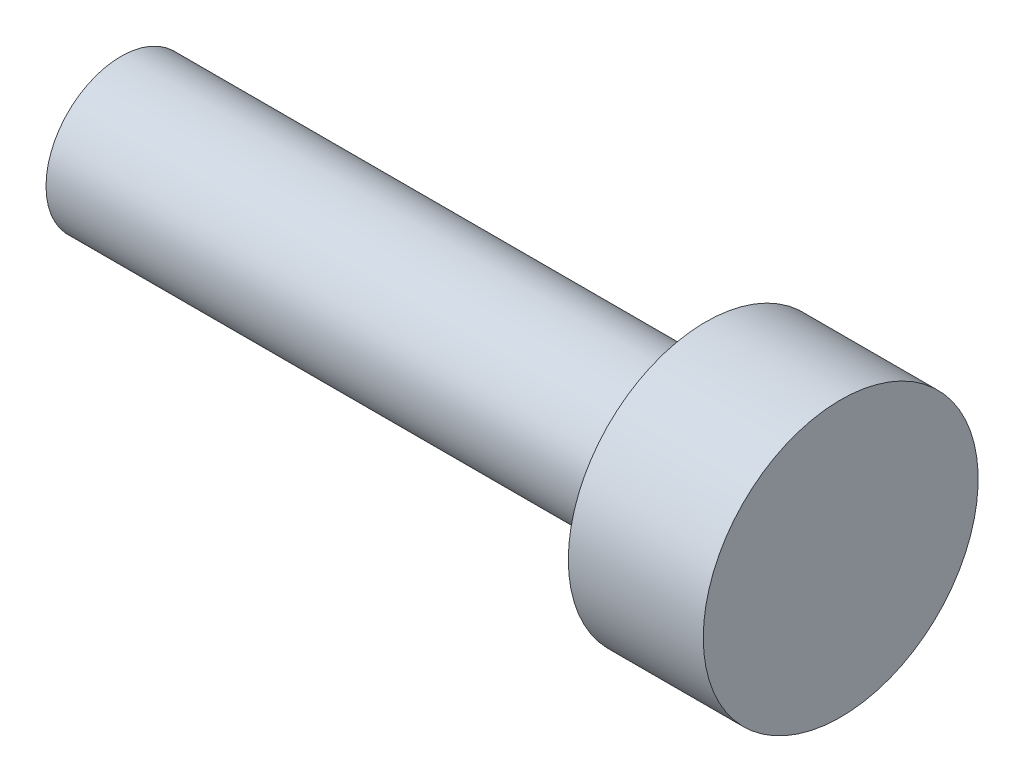
ISO-10303-21;
HEADER;
FILE_DESCRIPTION(('STEP AP214'),'2;1');
FILE_NAME('part.step','',(''),(''),'','','');
FILE_SCHEMA(('AUTOMOTIVE_DESIGN { 1 0 10303 214 1 1 1 1 }'));
ENDSEC;
DATA;
#1=APPLICATION_CONTEXT('core data for automotive mechanical design processes');
#2=APPLICATION_PROTOCOL_DEFINITION('international standard','automotive_design',2000,#1);
#3=PRODUCT_CONTEXT('',#1,'mechanical');
#4=PRODUCT('Part','Part','',(#3));
#5=PRODUCT_RELATED_PRODUCT_CATEGORY('part','',(#4));
#6=PRODUCT_DEFINITION_FORMATION('','',#4);
#7=PRODUCT_DEFINITION_CONTEXT('part definition',#1,'design');
#8=PRODUCT_DEFINITION('design','',#6,#7);
#9=PRODUCT_DEFINITION_SHAPE('','',#8);
#10=(LENGTH_UNIT() NAMED_UNIT(*) SI_UNIT(.MILLI.,.METRE.));
#11=(NAMED_UNIT(*) PLANE_ANGLE_UNIT() SI_UNIT($,.RADIAN.));
#12=(NAMED_UNIT(*) SI_UNIT($,.STERADIAN.) SOLID_ANGLE_UNIT());
#13=UNCERTAINTY_MEASURE_WITH_UNIT(LENGTH_MEASURE(1.E-05),#10,'distance_accuracy_value','');
#14=(GEOMETRIC_REPRESENTATION_CONTEXT(3) GLOBAL_UNCERTAINTY_ASSIGNED_CONTEXT((#13)) GLOBAL_UNIT_ASSIGNED_CONTEXT((#10,
#11,#12)) REPRESENTATION_CONTEXT('',''));
#15=CARTESIAN_POINT('',(0.,0.,0.));
#16=DIRECTION('',(0.,0.,1.));
#17=DIRECTION('',(1.,0.,0.));
#18=AXIS2_PLACEMENT_3D('',#15,#16,#17);
#19=CARTESIAN_POINT('',(165.,1.5,0.));
#20=DIRECTION('',(1.,0.,0.));
#21=DIRECTION('',(0.,0.,-1.));
#22=AXIS2_PLACEMENT_3D('',#19,#20,#21);
#23=PLANE('',#22);
#24=CARTESIAN_POINT('',(165.,0.,0.));
#25=DIRECTION('',(-1.,0.,0.));
#26=DIRECTION('',(0.,0.,1.));
#27=AXIS2_PLACEMENT_3D('',#24,#25,#26);
#28=CIRCLE('',#27,1.5);
#29=CARTESIAN_POINT('',(165.,0.,1.5));
#30=VERTEX_POINT('',#29);
#31=EDGE_CURVE('E54',#30,#30,#28,.T.);
#32=ORIENTED_EDGE('',*,*,#31,.T.);
#33=EDGE_LOOP('',(#32));
#34=FACE_BOUND('',#33,.T.);
#35=ADVANCED_FACE('F37',(#34),#23,.F.);
#36=CARTESIAN_POINT('',(179.4,0.,0.));
#37=DIRECTION('',(-1.,0.,0.));
#38=DIRECTION('',(0.,0.,1.));
#39=AXIS2_PLACEMENT_3D('',#36,#37,#38);
#40=PLANE('',#39);
#41=CARTESIAN_POINT('',(179.4,0.,0.));
#42=DIRECTION('',(-1.,0.,0.));
#43=DIRECTION('',(0.,0.,1.));
#44=AXIS2_PLACEMENT_3D('',#41,#42,#43);
#45=CIRCLE('',#44,2.75);
#46=CARTESIAN_POINT('',(179.4,0.,2.75));
#47=VERTEX_POINT('',#46);
#48=EDGE_CURVE('E10',#47,#47,#45,.T.);
#49=ORIENTED_EDGE('',*,*,#48,.F.);
#50=EDGE_LOOP('',(#49));
#51=FACE_BOUND('',#50,.T.);
#52=ADVANCED_FACE('F75',(#51),#40,.F.);
#53=CARTESIAN_POINT('',(-110.,0.,0.));
#54=DIRECTION('',(-1.,0.,0.));
#55=DIRECTION('',(0.,0.,1.));
#56=AXIS2_PLACEMENT_3D('',#53,#54,#55);
#57=CYLINDRICAL_SURFACE('',#56,2.75);
#58=CARTESIAN_POINT('',(176.7,0.,0.));
#59=DIRECTION('',(-1.,0.,0.));
#60=DIRECTION('',(0.,0.,1.));
#61=AXIS2_PLACEMENT_3D('',#58,#59,#60);
#62=CIRCLE('',#61,2.75);
#63=CARTESIAN_POINT('',(176.7,0.,2.75));
#64=VERTEX_POINT('',#63);
#65=EDGE_CURVE('E44',#64,#64,#62,.T.);
#66=ORIENTED_EDGE('',*,*,#65,.F.);
#67=EDGE_LOOP('',(#66));
#68=FACE_BOUND('',#67,.T.);
#69=ORIENTED_EDGE('',*,*,#48,.T.);
#70=EDGE_LOOP('',(#69));
#71=FACE_BOUND('',#70,.T.);
#72=ADVANCED_FACE('F70',(#68,#71),#57,.T.);
#73=CARTESIAN_POINT('',(176.7,2.75,0.));
#74=DIRECTION('',(1.,0.,0.));
#75=DIRECTION('',(0.,0.,-1.));
#76=AXIS2_PLACEMENT_3D('',#73,#74,#75);
#77=PLANE('',#76);
#78=CARTESIAN_POINT('',(176.7,0.,0.));
#79=DIRECTION('',(-1.,0.,0.));
#80=DIRECTION('',(0.,0.,1.));
#81=AXIS2_PLACEMENT_3D('',#78,#79,#80);
#82=CIRCLE('',#81,1.5);
#83=CARTESIAN_POINT('',(176.7,0.,1.5));
#84=VERTEX_POINT('',#83);
#85=EDGE_CURVE('E49',#84,#84,#82,.T.);
#86=ORIENTED_EDGE('',*,*,#85,.F.);
#87=EDGE_LOOP('',(#86));
#88=FACE_BOUND('',#87,.T.);
#89=ORIENTED_EDGE('',*,*,#65,.T.);
#90=EDGE_LOOP('',(#89));
#91=FACE_BOUND('',#90,.T.);
#92=ADVANCED_FACE('F65',(#88,#91),#77,.F.);
#93=CARTESIAN_POINT('',(-110.,0.,0.));
#94=DIRECTION('',(-1.,0.,0.));
#95=DIRECTION('',(0.,0.,1.));
#96=AXIS2_PLACEMENT_3D('',#93,#94,#95);
#97=CYLINDRICAL_SURFACE('',#96,1.5);
#98=ORIENTED_EDGE('',*,*,#31,.F.);
#99=EDGE_LOOP('',(#98));
#100=FACE_BOUND('',#99,.T.);
#101=ORIENTED_EDGE('',*,*,#85,.T.);
#102=EDGE_LOOP('',(#101));
#103=FACE_BOUND('',#102,.T.);
#104=ADVANCED_FACE('F62',(#100,#103),#97,.T.);
#105=CLOSED_SHELL('',(#35,#52,#72,#92,#104));
#106=MANIFOLD_SOLID_BREP('B2',#105);
#107=ADVANCED_BREP_SHAPE_REPRESENTATION('',(#18,#106),#14);
#108=SHAPE_DEFINITION_REPRESENTATION(#9,#107);
ENDSEC;
END-ISO-10303-21;
